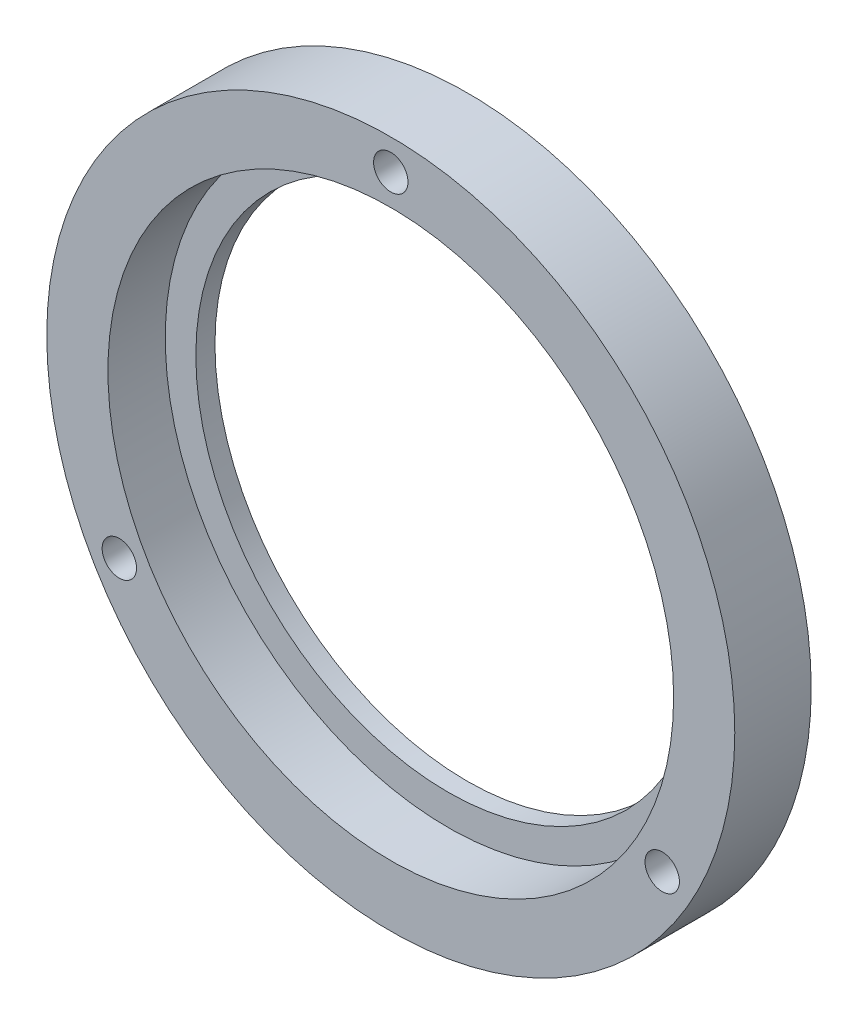
ISO-10303-21;
HEADER;
FILE_DESCRIPTION(('STEP AP214'),'2;1');
FILE_NAME('part.step','',(''),(''),'','','');
FILE_SCHEMA(('AUTOMOTIVE_DESIGN { 1 0 10303 214 1 1 1 1 }'));
ENDSEC;
DATA;
#1=APPLICATION_CONTEXT('core data for automotive mechanical design processes');
#2=APPLICATION_PROTOCOL_DEFINITION('international standard','automotive_design',2000,#1);
#3=PRODUCT_CONTEXT('',#1,'mechanical');
#4=PRODUCT('Part','Part','',(#3));
#5=PRODUCT_RELATED_PRODUCT_CATEGORY('part','',(#4));
#6=PRODUCT_DEFINITION_FORMATION('','',#4);
#7=PRODUCT_DEFINITION_CONTEXT('part definition',#1,'design');
#8=PRODUCT_DEFINITION('design','',#6,#7);
#9=PRODUCT_DEFINITION_SHAPE('','',#8);
#10=(LENGTH_UNIT() NAMED_UNIT(*) SI_UNIT(.MILLI.,.METRE.));
#11=(NAMED_UNIT(*) PLANE_ANGLE_UNIT() SI_UNIT($,.RADIAN.));
#12=(NAMED_UNIT(*) SI_UNIT($,.STERADIAN.) SOLID_ANGLE_UNIT());
#13=UNCERTAINTY_MEASURE_WITH_UNIT(LENGTH_MEASURE(1.E-05),#10,'distance_accuracy_value','');
#14=(GEOMETRIC_REPRESENTATION_CONTEXT(3) GLOBAL_UNCERTAINTY_ASSIGNED_CONTEXT((#13)) GLOBAL_UNIT_ASSIGNED_CONTEXT((#10,
#11,#12)) REPRESENTATION_CONTEXT('',''));
#15=CARTESIAN_POINT('',(0.,0.,0.));
#16=DIRECTION('',(0.,0.,1.));
#17=DIRECTION('',(1.,0.,0.));
#18=AXIS2_PLACEMENT_3D('',#15,#16,#17);
#19=CARTESIAN_POINT('',(0.,0.,30.));
#20=DIRECTION('',(0.,0.,1.));
#21=DIRECTION('',(1.,0.,0.));
#22=AXIS2_PLACEMENT_3D('',#19,#20,#21);
#23=CYLINDRICAL_SURFACE('',#22,33.);
#24=CARTESIAN_POINT('',(0.,0.,-7.5));
#25=DIRECTION('',(0.,0.,1.));
#26=DIRECTION('',(1.,0.,0.));
#27=AXIS2_PLACEMENT_3D('',#24,#25,#26);
#28=CIRCLE('',#27,33.);
#29=CARTESIAN_POINT('',(33.,0.,-7.5));
#30=VERTEX_POINT('',#29);
#31=EDGE_CURVE('E54',#30,#30,#28,.T.);
#32=ORIENTED_EDGE('',*,*,#31,.T.);
#33=EDGE_LOOP('',(#32));
#34=FACE_BOUND('',#33,.T.);
#35=CARTESIAN_POINT('',(0.,0.,-9.99999999999999));
#36=DIRECTION('',(0.,0.,1.));
#37=DIRECTION('',(1.,0.,0.));
#38=AXIS2_PLACEMENT_3D('',#35,#36,#37);
#39=CIRCLE('',#38,33.);
#40=CARTESIAN_POINT('',(33.,0.,-9.99999999999999));
#41=VERTEX_POINT('',#40);
#42=EDGE_CURVE('E10',#41,#41,#39,.T.);
#43=ORIENTED_EDGE('',*,*,#42,.F.);
#44=EDGE_LOOP('',(#43));
#45=FACE_BOUND('',#44,.T.);
#46=ADVANCED_FACE('F32',(#34,#45),#23,.F.);
#47=CARTESIAN_POINT('',(33.,0.,-10.));
#48=DIRECTION('',(0.,0.,-1.));
#49=DIRECTION('',(-1.,0.,0.));
#50=AXIS2_PLACEMENT_3D('',#47,#48,#49);
#51=PLANE('',#50);
#52=CARTESIAN_POINT('',(-35.5070415551622,-20.4999999999997,-10.));
#53=DIRECTION('',(0.,0.,1.));
#54=DIRECTION('',(-0.499999999999992,0.866025403784443,0.));
#55=AXIS2_PLACEMENT_3D('',#52,#53,#54);
#56=CIRCLE('',#55,2.25);
#57=CARTESIAN_POINT('',(-36.6320415551622,-18.5514428414847,-10.));
#58=VERTEX_POINT('',#57);
#59=EDGE_CURVE('E67',#58,#58,#56,.T.);
#60=ORIENTED_EDGE('',*,*,#59,.T.);
#61=EDGE_LOOP('',(#60));
#62=FACE_BOUND('',#61,.T.);
#63=CARTESIAN_POINT('',(35.5070415551619,-20.5000000000002,-10.));
#64=DIRECTION('',(0.,0.,1.));
#65=DIRECTION('',(-0.500000000000004,-0.866025403784436,0.));
#66=AXIS2_PLACEMENT_3D('',#63,#64,#65);
#67=CIRCLE('',#66,2.25);
#68=CARTESIAN_POINT('',(34.3820415551619,-22.4485571585152,-10.));
#69=VERTEX_POINT('',#68);
#70=EDGE_CURVE('E61',#69,#69,#67,.T.);
#71=ORIENTED_EDGE('',*,*,#70,.T.);
#72=EDGE_LOOP('',(#71));
#73=FACE_BOUND('',#72,.T.);
#74=CARTESIAN_POINT('',(0.,41.,-10.));
#75=DIRECTION('',(0.,0.,1.));
#76=DIRECTION('',(1.,0.,0.));
#77=AXIS2_PLACEMENT_3D('',#74,#75,#76);
#78=CIRCLE('',#77,2.25);
#79=CARTESIAN_POINT('',(2.25,41.,-10.));
#80=VERTEX_POINT('',#79);
#81=EDGE_CURVE('E57',#80,#80,#78,.T.);
#82=ORIENTED_EDGE('',*,*,#81,.T.);
#83=EDGE_LOOP('',(#82));
#84=FACE_BOUND('',#83,.T.);
#85=ORIENTED_EDGE('',*,*,#42,.T.);
#86=EDGE_LOOP('',(#85));
#87=FACE_BOUND('',#86,.T.);
#88=CARTESIAN_POINT('',(0.,0.,-9.99999999999999));
#89=DIRECTION('',(0.,0.,1.));
#90=DIRECTION('',(1.,0.,0.));
#91=AXIS2_PLACEMENT_3D('',#88,#89,#90);
#92=CIRCLE('',#91,45.);
#93=CARTESIAN_POINT('',(45.,0.,-9.99999999999999));
#94=VERTEX_POINT('',#93);
#95=EDGE_CURVE('E38',#94,#94,#92,.T.);
#96=ORIENTED_EDGE('',*,*,#95,.F.);
#97=EDGE_LOOP('',(#96));
#98=FACE_BOUND('',#97,.T.);
#99=ADVANCED_FACE('F76',(#62,#73,#84,#87,#98),#51,.T.);
#100=CARTESIAN_POINT('',(0.,0.,30.));
#101=DIRECTION('',(0.,0.,1.));
#102=DIRECTION('',(1.,0.,0.));
#103=AXIS2_PLACEMENT_3D('',#100,#101,#102);
#104=CYLINDRICAL_SURFACE('',#103,45.);
#105=ORIENTED_EDGE('',*,*,#95,.T.);
#106=EDGE_LOOP('',(#105));
#107=FACE_BOUND('',#106,.T.);
#108=CARTESIAN_POINT('',(0.,0.,0.));
#109=DIRECTION('',(0.,0.,1.));
#110=DIRECTION('',(1.,0.,0.));
#111=AXIS2_PLACEMENT_3D('',#108,#109,#110);
#112=CIRCLE('',#111,45.);
#113=CARTESIAN_POINT('',(45.,0.,0.));
#114=VERTEX_POINT('',#113);
#115=EDGE_CURVE('E42',#114,#114,#112,.T.);
#116=ORIENTED_EDGE('',*,*,#115,.F.);
#117=EDGE_LOOP('',(#116));
#118=FACE_BOUND('',#117,.T.);
#119=ADVANCED_FACE('F90',(#107,#118),#104,.T.);
#120=CARTESIAN_POINT('',(45.,0.,0.));
#121=DIRECTION('',(0.,0.,1.));
#122=DIRECTION('',(1.,0.,0.));
#123=AXIS2_PLACEMENT_3D('',#120,#121,#122);
#124=PLANE('',#123);
#125=CARTESIAN_POINT('',(-35.5070415551622,-20.4999999999997,0.));
#126=DIRECTION('',(0.,0.,1.));
#127=DIRECTION('',(-0.499999999999992,0.866025403784443,0.));
#128=AXIS2_PLACEMENT_3D('',#125,#126,#127);
#129=CIRCLE('',#128,2.25);
#130=CARTESIAN_POINT('',(-36.6320415551622,-18.5514428414847,0.));
#131=VERTEX_POINT('',#130);
#132=EDGE_CURVE('E70',#131,#131,#129,.T.);
#133=ORIENTED_EDGE('',*,*,#132,.F.);
#134=EDGE_LOOP('',(#133));
#135=FACE_BOUND('',#134,.T.);
#136=CARTESIAN_POINT('',(35.5070415551619,-20.5000000000002,0.));
#137=DIRECTION('',(0.,0.,1.));
#138=DIRECTION('',(-0.500000000000004,-0.866025403784436,0.));
#139=AXIS2_PLACEMENT_3D('',#136,#137,#138);
#140=CIRCLE('',#139,2.25);
#141=CARTESIAN_POINT('',(34.3820415551619,-22.4485571585152,0.));
#142=VERTEX_POINT('',#141);
#143=EDGE_CURVE('E64',#142,#142,#140,.T.);
#144=ORIENTED_EDGE('',*,*,#143,.F.);
#145=EDGE_LOOP('',(#144));
#146=FACE_BOUND('',#145,.T.);
#147=CARTESIAN_POINT('',(0.,41.,0.));
#148=DIRECTION('',(0.,0.,1.));
#149=DIRECTION('',(1.,0.,0.));
#150=AXIS2_PLACEMENT_3D('',#147,#148,#149);
#151=CIRCLE('',#150,2.25);
#152=CARTESIAN_POINT('',(2.25,41.,0.));
#153=VERTEX_POINT('',#152);
#154=EDGE_CURVE('E58',#153,#153,#151,.T.);
#155=ORIENTED_EDGE('',*,*,#154,.F.);
#156=EDGE_LOOP('',(#155));
#157=FACE_BOUND('',#156,.T.);
#158=ORIENTED_EDGE('',*,*,#115,.T.);
#159=EDGE_LOOP('',(#158));
#160=FACE_BOUND('',#159,.T.);
#161=CARTESIAN_POINT('',(0.,0.,0.));
#162=DIRECTION('',(0.,0.,1.));
#163=DIRECTION('',(1.,0.,0.));
#164=AXIS2_PLACEMENT_3D('',#161,#162,#163);
#165=CIRCLE('',#164,37.);
#166=CARTESIAN_POINT('',(37.,0.,0.));
#167=VERTEX_POINT('',#166);
#168=EDGE_CURVE('E46',#167,#167,#165,.T.);
#169=ORIENTED_EDGE('',*,*,#168,.F.);
#170=EDGE_LOOP('',(#169));
#171=FACE_BOUND('',#170,.T.);
#172=ADVANCED_FACE('F86',(#135,#146,#157,#160,#171),#124,.T.);
#173=CARTESIAN_POINT('',(0.,0.,30.));
#174=DIRECTION('',(0.,0.,1.));
#175=DIRECTION('',(1.,0.,0.));
#176=AXIS2_PLACEMENT_3D('',#173,#174,#175);
#177=CYLINDRICAL_SURFACE('',#176,37.);
#178=ORIENTED_EDGE('',*,*,#168,.T.);
#179=EDGE_LOOP('',(#178));
#180=FACE_BOUND('',#179,.T.);
#181=CARTESIAN_POINT('',(0.,0.,-7.5));
#182=DIRECTION('',(0.,0.,1.));
#183=DIRECTION('',(1.,0.,0.));
#184=AXIS2_PLACEMENT_3D('',#181,#182,#183);
#185=CIRCLE('',#184,37.);
#186=CARTESIAN_POINT('',(37.,0.,-7.5));
#187=VERTEX_POINT('',#186);
#188=EDGE_CURVE('E51',#187,#187,#185,.T.);
#189=ORIENTED_EDGE('',*,*,#188,.F.);
#190=EDGE_LOOP('',(#189));
#191=FACE_BOUND('',#190,.T.);
#192=ADVANCED_FACE('F89',(#180,#191),#177,.F.);
#193=CARTESIAN_POINT('',(37.,0.,-7.5));
#194=DIRECTION('',(0.,0.,1.));
#195=DIRECTION('',(1.,0.,0.));
#196=AXIS2_PLACEMENT_3D('',#193,#194,#195);
#197=PLANE('',#196);
#198=ORIENTED_EDGE('',*,*,#188,.T.);
#199=EDGE_LOOP('',(#198));
#200=FACE_BOUND('',#199,.T.);
#201=ORIENTED_EDGE('',*,*,#31,.F.);
#202=EDGE_LOOP('',(#201));
#203=FACE_BOUND('',#202,.T.);
#204=ADVANCED_FACE('F102',(#200,#203),#197,.T.);
#205=CARTESIAN_POINT('',(0.,41.,-10.));
#206=DIRECTION('',(0.,0.,1.));
#207=DIRECTION('',(1.,0.,0.));
#208=AXIS2_PLACEMENT_3D('',#205,#206,#207);
#209=CYLINDRICAL_SURFACE('',#208,2.25);
#210=ORIENTED_EDGE('',*,*,#81,.F.);
#211=EDGE_LOOP('',(#210));
#212=FACE_BOUND('',#211,.T.);
#213=ORIENTED_EDGE('',*,*,#154,.T.);
#214=EDGE_LOOP('',(#213));
#215=FACE_BOUND('',#214,.T.);
#216=ADVANCED_FACE('F108',(#212,#215),#209,.F.);
#217=CARTESIAN_POINT('',(35.5070415551619,-20.5000000000002,-10.));
#218=DIRECTION('',(0.,0.,1.));
#219=DIRECTION('',(1.,0.,0.));
#220=AXIS2_PLACEMENT_3D('',#217,#218,#219);
#221=CYLINDRICAL_SURFACE('',#220,2.25);
#222=ORIENTED_EDGE('',*,*,#70,.F.);
#223=EDGE_LOOP('',(#222));
#224=FACE_BOUND('',#223,.T.);
#225=ORIENTED_EDGE('',*,*,#143,.T.);
#226=EDGE_LOOP('',(#225));
#227=FACE_BOUND('',#226,.T.);
#228=ADVANCED_FACE('F82',(#224,#227),#221,.F.);
#229=CARTESIAN_POINT('',(-35.5070415551622,-20.4999999999997,-10.));
#230=DIRECTION('',(0.,0.,1.));
#231=DIRECTION('',(1.,0.,0.));
#232=AXIS2_PLACEMENT_3D('',#229,#230,#231);
#233=CYLINDRICAL_SURFACE('',#232,2.25);
#234=ORIENTED_EDGE('',*,*,#59,.F.);
#235=EDGE_LOOP('',(#234));
#236=FACE_BOUND('',#235,.T.);
#237=ORIENTED_EDGE('',*,*,#132,.T.);
#238=EDGE_LOOP('',(#237));
#239=FACE_BOUND('',#238,.T.);
#240=ADVANCED_FACE('F79',(#236,#239),#233,.F.);
#241=CLOSED_SHELL('',(#46,#99,#119,#172,#192,#204,#216,#228,#240));
#242=MANIFOLD_SOLID_BREP('B2',#241);
#243=ADVANCED_BREP_SHAPE_REPRESENTATION('',(#18,#242),#14);
#244=SHAPE_DEFINITION_REPRESENTATION(#9,#243);
ENDSEC;
END-ISO-10303-21;
